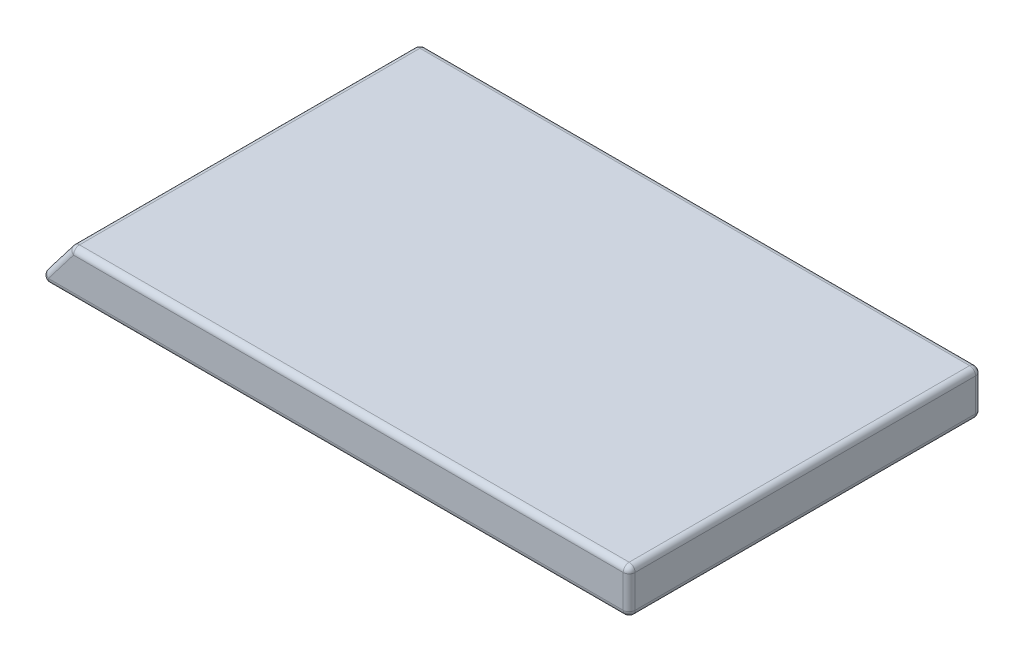
ISO-10303-21;
HEADER;
FILE_DESCRIPTION(('STEP AP214'),'2;1');
FILE_NAME('part.step','',(''),(''),'','','');
FILE_SCHEMA(('AUTOMOTIVE_DESIGN { 1 0 10303 214 1 1 1 1 }'));
ENDSEC;
DATA;
#1=APPLICATION_CONTEXT('core data for automotive mechanical design processes');
#2=APPLICATION_PROTOCOL_DEFINITION('international standard','automotive_design',2000,#1);
#3=PRODUCT_CONTEXT('',#1,'mechanical');
#4=PRODUCT('Part','Part','',(#3));
#5=PRODUCT_RELATED_PRODUCT_CATEGORY('part','',(#4));
#6=PRODUCT_DEFINITION_FORMATION('','',#4);
#7=PRODUCT_DEFINITION_CONTEXT('part definition',#1,'design');
#8=PRODUCT_DEFINITION('design','',#6,#7);
#9=PRODUCT_DEFINITION_SHAPE('','',#8);
#10=(LENGTH_UNIT() NAMED_UNIT(*) SI_UNIT(.MILLI.,.METRE.));
#11=(NAMED_UNIT(*) PLANE_ANGLE_UNIT() SI_UNIT($,.RADIAN.));
#12=(NAMED_UNIT(*) SI_UNIT($,.STERADIAN.) SOLID_ANGLE_UNIT());
#13=UNCERTAINTY_MEASURE_WITH_UNIT(LENGTH_MEASURE(1.E-05),#10,'distance_accuracy_value','');
#14=(GEOMETRIC_REPRESENTATION_CONTEXT(3) GLOBAL_UNCERTAINTY_ASSIGNED_CONTEXT((#13)) GLOBAL_UNIT_ASSIGNED_CONTEXT((#10,
#11,#12)) REPRESENTATION_CONTEXT('',''));
#15=CARTESIAN_POINT('',(0.,0.,0.));
#16=DIRECTION('',(0.,0.,1.));
#17=DIRECTION('',(1.,0.,0.));
#18=AXIS2_PLACEMENT_3D('',#15,#16,#17);
#19=CARTESIAN_POINT('',(0.,75.,296.));
#20=DIRECTION('',(-1.,0.,0.));
#21=DIRECTION('',(0.,0.,1.));
#22=AXIS2_PLACEMENT_3D('',#19,#20,#21);
#23=PLANE('',#22);
#24=DIRECTION('',(0.,1.,0.));
#25=VECTOR('',#24,1.);
#26=CARTESIAN_POINT('',(0.,75.,286.));
#27=LINE('',#26,#25);
#28=CARTESIAN_POINT('',(0.,65.,286.));
#29=VERTEX_POINT('',#28);
#30=CARTESIAN_POINT('',(0.,9.99999999999999,286.));
#31=VERTEX_POINT('',#30);
#32=EDGE_CURVE('E188',#29,#31,#27,.F.);
#33=ORIENTED_EDGE('',*,*,#32,.T.);
#34=DIRECTION('',(0.,0.,-1.));
#35=VECTOR('',#34,1.);
#36=CARTESIAN_POINT('',(0.,9.99999999999999,296.));
#37=LINE('',#36,#35);
#38=CARTESIAN_POINT('',(0.,9.99999999999999,-286.));
#39=VERTEX_POINT('',#38);
#40=EDGE_CURVE('E191',#31,#39,#37,.T.);
#41=ORIENTED_EDGE('',*,*,#40,.T.);
#42=DIRECTION('',(0.,1.,0.));
#43=VECTOR('',#42,1.);
#44=CARTESIAN_POINT('',(0.,75.,-286.));
#45=LINE('',#44,#43);
#46=CARTESIAN_POINT('',(0.,65.,-286.));
#47=VERTEX_POINT('',#46);
#48=EDGE_CURVE('E193',#39,#47,#45,.T.);
#49=ORIENTED_EDGE('',*,*,#48,.T.);
#50=DIRECTION('',(0.,0.,-1.));
#51=VECTOR('',#50,1.);
#52=CARTESIAN_POINT('',(0.,65.,296.));
#53=LINE('',#52,#51);
#54=EDGE_CURVE('E186',#47,#29,#53,.F.);
#55=ORIENTED_EDGE('',*,*,#54,.T.);
#56=EDGE_LOOP('',(#33,#41,#49,#55));
#57=FACE_BOUND('',#56,.T.);
#58=ADVANCED_FACE('F39',(#57),#23,.F.);
#59=CARTESIAN_POINT('',(-938.450475901577,74.9999999999999,296.));
#60=DIRECTION('',(0.,-1.,0.));
#61=DIRECTION('',(1.,0.,0.));
#62=AXIS2_PLACEMENT_3D('',#59,#60,#61);
#63=PLANE('',#62);
#64=DIRECTION('',(-1.,0.,0.));
#65=VECTOR('',#64,1.);
#66=CARTESIAN_POINT('',(-938.450475901577,74.9999999999999,286.));
#67=LINE('',#66,#65);
#68=CARTESIAN_POINT('',(-933.519021641264,74.9999999999999,286.));
#69=VERTEX_POINT('',#68);
#70=CARTESIAN_POINT('',(-10.,75.,286.));
#71=VERTEX_POINT('',#70);
#72=EDGE_CURVE('E48',#69,#71,#67,.F.);
#73=ORIENTED_EDGE('',*,*,#72,.T.);
#74=DIRECTION('',(0.,0.,-1.));
#75=VECTOR('',#74,1.);
#76=CARTESIAN_POINT('',(-10.,75.,296.));
#77=LINE('',#76,#75);
#78=CARTESIAN_POINT('',(-10.,75.,-286.));
#79=VERTEX_POINT('',#78);
#80=EDGE_CURVE('E11',#71,#79,#77,.T.);
#81=ORIENTED_EDGE('',*,*,#80,.T.);
#82=DIRECTION('',(-1.,0.,0.));
#83=VECTOR('',#82,1.);
#84=CARTESIAN_POINT('',(-938.450475901577,74.9999999999999,-286.));
#85=LINE('',#84,#83);
#86=CARTESIAN_POINT('',(-933.519021641264,74.9999999999999,-286.));
#87=VERTEX_POINT('',#86);
#88=EDGE_CURVE('E204',#79,#87,#85,.T.);
#89=ORIENTED_EDGE('',*,*,#88,.T.);
#90=DIRECTION('',(0.,0.,-1.));
#91=VECTOR('',#90,1.);
#92=CARTESIAN_POINT('',(-933.519021641264,74.9999999999999,296.));
#93=LINE('',#92,#91);
#94=EDGE_CURVE('E56',#87,#69,#93,.F.);
#95=ORIENTED_EDGE('',*,*,#94,.T.);
#96=EDGE_LOOP('',(#73,#81,#89,#95));
#97=FACE_BOUND('',#96,.T.);
#98=ADVANCED_FACE('F300',(#97),#63,.F.);
#99=CARTESIAN_POINT('',(-996.,-1.21974821195076E-13,296.));
#100=DIRECTION('',(0.793353340291232,-0.608761429008725,0.));
#101=DIRECTION('',(0.608761429008725,0.793353340291232,0.));
#102=AXIS2_PLACEMENT_3D('',#99,#100,#101);
#103=PLANE('',#102);
#104=DIRECTION('',(0.,0.,-1.));
#105=VECTOR('',#104,1.);
#106=CARTESIAN_POINT('',(-941.452555044177,71.0876142900871,296.));
#107=LINE('',#106,#105);
#108=CARTESIAN_POINT('',(-941.452555044177,71.0876142900871,286.));
#109=VERTEX_POINT('',#108);
#110=CARTESIAN_POINT('',(-941.452555044177,71.0876142900871,-286.));
#111=VERTEX_POINT('',#110);
#112=EDGE_CURVE('E134',#109,#111,#107,.T.);
#113=ORIENTED_EDGE('',*,*,#112,.T.);
#114=DIRECTION('',(-0.608761429008725,-0.793353340291232,0.));
#115=VECTOR('',#114,1.);
#116=CARTESIAN_POINT('',(-996.,-1.18356756033201E-13,-286.));
#117=LINE('',#116,#115);
#118=CARTESIAN_POINT('',(-983.65553938302,16.0876142900872,-286.));
#119=VERTEX_POINT('',#118);
#120=EDGE_CURVE('E170',#111,#119,#117,.T.);
#121=ORIENTED_EDGE('',*,*,#120,.T.);
#122=DIRECTION('',(0.,0.,-1.));
#123=VECTOR('',#122,1.);
#124=CARTESIAN_POINT('',(-983.65553938302,16.0876142900872,296.));
#125=LINE('',#124,#123);
#126=CARTESIAN_POINT('',(-983.65553938302,16.0876142900872,286.));
#127=VERTEX_POINT('',#126);
#128=EDGE_CURVE('E133',#119,#127,#125,.F.);
#129=ORIENTED_EDGE('',*,*,#128,.T.);
#130=DIRECTION('',(-0.608761429008725,-0.793353340291232,0.));
#131=VECTOR('',#130,1.);
#132=CARTESIAN_POINT('',(-996.,-1.21974821195076E-13,286.));
#133=LINE('',#132,#131);
#134=EDGE_CURVE('E127',#127,#109,#133,.F.);
#135=ORIENTED_EDGE('',*,*,#134,.T.);
#136=EDGE_LOOP('',(#113,#121,#129,#135));
#137=FACE_BOUND('',#136,.T.);
#138=ADVANCED_FACE('F126',(#137),#103,.F.);
#139=CARTESIAN_POINT('',(0.,0.,296.));
#140=DIRECTION('',(0.,1.,0.));
#141=DIRECTION('',(-1.,0.,0.));
#142=AXIS2_PLACEMENT_3D('',#139,#140,#141);
#143=PLANE('',#142);
#144=DIRECTION('',(1.,0.,0.));
#145=VECTOR('',#144,1.);
#146=CARTESIAN_POINT('',(0.,0.,286.));
#147=LINE('',#146,#145);
#148=CARTESIAN_POINT('',(-10.,0.,286.));
#149=VERTEX_POINT('',#148);
#150=CARTESIAN_POINT('',(-975.722005980107,-1.19491483148117E-13,286.));
#151=VERTEX_POINT('',#150);
#152=EDGE_CURVE('E176',#149,#151,#147,.F.);
#153=ORIENTED_EDGE('',*,*,#152,.T.);
#154=DIRECTION('',(0.,0.,-1.));
#155=VECTOR('',#154,1.);
#156=CARTESIAN_POINT('',(-975.722005980107,-1.19491483148117E-13,296.));
#157=LINE('',#156,#155);
#158=CARTESIAN_POINT('',(-975.722005980107,-1.19491483148117E-13,-286.));
#159=VERTEX_POINT('',#158);
#160=EDGE_CURVE('E184',#151,#159,#157,.T.);
#161=ORIENTED_EDGE('',*,*,#160,.T.);
#162=DIRECTION('',(1.,0.,0.));
#163=VECTOR('',#162,1.);
#164=CARTESIAN_POINT('',(0.,0.,-286.));
#165=LINE('',#164,#163);
#166=CARTESIAN_POINT('',(-10.,0.,-286.));
#167=VERTEX_POINT('',#166);
#168=EDGE_CURVE('E185',#159,#167,#165,.T.);
#169=ORIENTED_EDGE('',*,*,#168,.T.);
#170=DIRECTION('',(0.,0.,-1.));
#171=VECTOR('',#170,1.);
#172=CARTESIAN_POINT('',(-10.,0.,296.));
#173=LINE('',#172,#171);
#174=EDGE_CURVE('E177',#167,#149,#173,.F.);
#175=ORIENTED_EDGE('',*,*,#174,.T.);
#176=EDGE_LOOP('',(#153,#161,#169,#175));
#177=FACE_BOUND('',#176,.T.);
#178=ADVANCED_FACE('F284',(#177),#143,.F.);
#179=CARTESIAN_POINT('',(0.,0.,296.));
#180=DIRECTION('',(0.,0.,-1.));
#181=DIRECTION('',(-1.,0.,0.));
#182=AXIS2_PLACEMENT_3D('',#179,#180,#181);
#183=PLANE('',#182);
#184=DIRECTION('',(-0.608761429008725,-0.793353340291232,0.));
#185=VECTOR('',#184,1.);
#186=CARTESIAN_POINT('',(-618.958351058138,474.94344720187,296.));
#187=LINE('',#186,#185);
#188=CARTESIAN_POINT('',(-933.519021641264,64.9999999999999,296.));
#189=VERTEX_POINT('',#188);
#190=CARTESIAN_POINT('',(-975.722005980107,9.99999999999989,296.));
#191=VERTEX_POINT('',#190);
#192=EDGE_CURVE('E145',#189,#191,#187,.T.);
#193=ORIENTED_EDGE('',*,*,#192,.T.);
#194=DIRECTION('',(1.,0.,0.));
#195=VECTOR('',#194,1.);
#196=CARTESIAN_POINT('',(0.,10.,296.));
#197=LINE('',#196,#195);
#198=CARTESIAN_POINT('',(-10.,10.,296.));
#199=VERTEX_POINT('',#198);
#200=EDGE_CURVE('E203',#191,#199,#197,.T.);
#201=ORIENTED_EDGE('',*,*,#200,.T.);
#202=DIRECTION('',(0.,1.,0.));
#203=VECTOR('',#202,1.);
#204=CARTESIAN_POINT('',(-10.,0.,296.));
#205=LINE('',#204,#203);
#206=CARTESIAN_POINT('',(-10.,65.,296.));
#207=VERTEX_POINT('',#206);
#208=EDGE_CURVE('E196',#199,#207,#205,.T.);
#209=ORIENTED_EDGE('',*,*,#208,.T.);
#210=DIRECTION('',(-1.,0.,0.));
#211=VECTOR('',#210,1.);
#212=CARTESIAN_POINT('',(0.,65.,296.));
#213=LINE('',#212,#211);
#214=EDGE_CURVE('E198',#207,#189,#213,.T.);
#215=ORIENTED_EDGE('',*,*,#214,.T.);
#216=EDGE_LOOP('',(#193,#201,#209,#215));
#217=FACE_BOUND('',#216,.T.);
#218=ADVANCED_FACE('F268',(#217),#183,.F.);
#219=CARTESIAN_POINT('',(0.,0.,-296.));
#220=DIRECTION('',(0.,0.,-1.));
#221=DIRECTION('',(-1.,0.,0.));
#222=AXIS2_PLACEMENT_3D('',#219,#220,#221);
#223=PLANE('',#222);
#224=DIRECTION('',(1.,0.,0.));
#225=VECTOR('',#224,1.);
#226=CARTESIAN_POINT('',(-996.,9.99999999999988,-296.));
#227=LINE('',#226,#225);
#228=CARTESIAN_POINT('',(-10.,10.,-296.));
#229=VERTEX_POINT('',#228);
#230=CARTESIAN_POINT('',(-975.722005980108,9.99999999999988,-296.));
#231=VERTEX_POINT('',#230);
#232=EDGE_CURVE('E175',#229,#231,#227,.F.);
#233=ORIENTED_EDGE('',*,*,#232,.T.);
#234=DIRECTION('',(-0.608761429008725,-0.793353340291232,0.));
#235=VECTOR('',#234,1.);
#236=CARTESIAN_POINT('',(-930.516942498665,68.9123857099126,-296.));
#237=LINE('',#236,#235);
#238=CARTESIAN_POINT('',(-933.519021641264,64.9999999999999,-296.));
#239=VERTEX_POINT('',#238);
#240=EDGE_CURVE('E172',#231,#239,#237,.F.);
#241=ORIENTED_EDGE('',*,*,#240,.T.);
#242=DIRECTION('',(-1.,0.,0.));
#243=VECTOR('',#242,1.);
#244=CARTESIAN_POINT('',(0.,65.,-296.));
#245=LINE('',#244,#243);
#246=CARTESIAN_POINT('',(-10.,65.,-296.));
#247=VERTEX_POINT('',#246);
#248=EDGE_CURVE('E166',#239,#247,#245,.F.);
#249=ORIENTED_EDGE('',*,*,#248,.T.);
#250=DIRECTION('',(0.,1.,0.));
#251=VECTOR('',#250,1.);
#252=CARTESIAN_POINT('',(-10.,0.,-296.));
#253=LINE('',#252,#251);
#254=EDGE_CURVE('E174',#247,#229,#253,.F.);
#255=ORIENTED_EDGE('',*,*,#254,.T.);
#256=EDGE_LOOP('',(#233,#241,#249,#255));
#257=FACE_BOUND('',#256,.T.);
#258=ADVANCED_FACE('F483',(#257),#223,.T.);
#259=CARTESIAN_POINT('',(-10.,0.,286.));
#260=DIRECTION('',(0.,1.,0.));
#261=DIRECTION('',(0.,0.,1.));
#262=AXIS2_PLACEMENT_3D('',#259,#260,#261);
#263=CYLINDRICAL_SURFACE('',#262,10.);
#264=CARTESIAN_POINT('',(-10.,65.,286.));
#265=DIRECTION('',(0.,1.,0.));
#266=DIRECTION('',(0.,0.,1.));
#267=AXIS2_PLACEMENT_3D('',#264,#265,#266);
#268=CIRCLE('',#267,10.);
#269=EDGE_CURVE('E43',#207,#29,#268,.T.);
#270=ORIENTED_EDGE('',*,*,#269,.F.);
#271=ORIENTED_EDGE('',*,*,#208,.F.);
#272=CARTESIAN_POINT('',(-10.,9.99999999999999,286.));
#273=DIRECTION('',(0.,-1.,0.));
#274=DIRECTION('',(0.,0.,-1.));
#275=AXIS2_PLACEMENT_3D('',#272,#273,#274);
#276=CIRCLE('',#275,10.);
#277=EDGE_CURVE('E163',#31,#199,#276,.T.);
#278=ORIENTED_EDGE('',*,*,#277,.F.);
#279=ORIENTED_EDGE('',*,*,#32,.F.);
#280=EDGE_LOOP('',(#270,#271,#278,#279));
#281=FACE_BOUND('',#280,.T.);
#282=ADVANCED_FACE('F41',(#281),#263,.T.);
#283=CARTESIAN_POINT('',(-10.,65.,286.));
#284=DIRECTION('',(1.,0.,0.));
#285=DIRECTION('',(0.,0.,-1.));
#286=AXIS2_PLACEMENT_3D('',#283,#284,#285);
#287=SPHERICAL_SURFACE('',#286,10.);
#288=CARTESIAN_POINT('',(-10.,65.,286.));
#289=DIRECTION('',(1.,0.,0.));
#290=DIRECTION('',(0.,0.,-1.));
#291=AXIS2_PLACEMENT_3D('',#288,#289,#290);
#292=CIRCLE('',#291,10.);
#293=EDGE_CURVE('E249',#207,#71,#292,.F.);
#294=ORIENTED_EDGE('',*,*,#293,.F.);
#295=ORIENTED_EDGE('',*,*,#269,.T.);
#296=CARTESIAN_POINT('',(-10.,65.,286.));
#297=DIRECTION('',(0.,0.,1.));
#298=DIRECTION('',(1.,0.,0.));
#299=AXIS2_PLACEMENT_3D('',#296,#297,#298);
#300=CIRCLE('',#299,10.);
#301=EDGE_CURVE('E253',#71,#29,#300,.F.);
#302=ORIENTED_EDGE('',*,*,#301,.F.);
#303=EDGE_LOOP('',(#294,#295,#302));
#304=FACE_BOUND('',#303,.T.);
#305=ADVANCED_FACE('F292',(#304),#287,.T.);
#306=CARTESIAN_POINT('',(-10.,10.,286.));
#307=DIRECTION('',(0.,0.,1.));
#308=DIRECTION('',(1.,0.,0.));
#309=AXIS2_PLACEMENT_3D('',#306,#307,#308);
#310=SPHERICAL_SURFACE('',#309,10.);
#311=CARTESIAN_POINT('',(-10.,10.,286.));
#312=DIRECTION('',(0.,0.,1.));
#313=DIRECTION('',(1.,0.,0.));
#314=AXIS2_PLACEMENT_3D('',#311,#312,#313);
#315=CIRCLE('',#314,10.);
#316=EDGE_CURVE('E243',#31,#149,#315,.F.);
#317=ORIENTED_EDGE('',*,*,#316,.F.);
#318=ORIENTED_EDGE('',*,*,#277,.T.);
#319=CARTESIAN_POINT('',(-10.,10.,286.));
#320=DIRECTION('',(1.,0.,0.));
#321=DIRECTION('',(0.,1.,0.));
#322=AXIS2_PLACEMENT_3D('',#319,#320,#321);
#323=CIRCLE('',#322,10.);
#324=EDGE_CURVE('E250',#149,#199,#323,.F.);
#325=ORIENTED_EDGE('',*,*,#324,.F.);
#326=EDGE_LOOP('',(#317,#318,#325));
#327=FACE_BOUND('',#326,.T.);
#328=ADVANCED_FACE('F259',(#327),#310,.T.);
#329=CARTESIAN_POINT('',(-10.,65.,296.));
#330=DIRECTION('',(0.,0.,-1.));
#331=DIRECTION('',(-1.,0.,0.));
#332=AXIS2_PLACEMENT_3D('',#329,#330,#331);
#333=CYLINDRICAL_SURFACE('',#332,10.);
#334=ORIENTED_EDGE('',*,*,#301,.T.);
#335=ORIENTED_EDGE('',*,*,#54,.F.);
#336=CARTESIAN_POINT('',(-10.,65.,-286.));
#337=DIRECTION('',(0.,0.,-1.));
#338=DIRECTION('',(-1.,0.,0.));
#339=AXIS2_PLACEMENT_3D('',#336,#337,#338);
#340=CIRCLE('',#339,10.);
#341=EDGE_CURVE('E236',#79,#47,#340,.T.);
#342=ORIENTED_EDGE('',*,*,#341,.F.);
#343=ORIENTED_EDGE('',*,*,#80,.F.);
#344=EDGE_LOOP('',(#334,#335,#342,#343));
#345=FACE_BOUND('',#344,.T.);
#346=ADVANCED_FACE('F293',(#345),#333,.T.);
#347=CARTESIAN_POINT('',(0.,65.,286.));
#348=DIRECTION('',(-1.,0.,0.));
#349=DIRECTION('',(0.,-1.,0.));
#350=AXIS2_PLACEMENT_3D('',#347,#348,#349);
#351=CYLINDRICAL_SURFACE('',#350,10.);
#352=ORIENTED_EDGE('',*,*,#293,.T.);
#353=ORIENTED_EDGE('',*,*,#72,.F.);
#354=CARTESIAN_POINT('',(-933.519021641264,64.9999999999999,286.));
#355=DIRECTION('',(-1.,0.,0.));
#356=DIRECTION('',(0.,-1.,0.));
#357=AXIS2_PLACEMENT_3D('',#354,#355,#356);
#358=CIRCLE('',#357,10.);
#359=EDGE_CURVE('E146',#189,#69,#358,.T.);
#360=ORIENTED_EDGE('',*,*,#359,.F.);
#361=ORIENTED_EDGE('',*,*,#214,.F.);
#362=EDGE_LOOP('',(#352,#353,#360,#361));
#363=FACE_BOUND('',#362,.T.);
#364=ADVANCED_FACE('F446',(#363),#351,.T.);
#365=CARTESIAN_POINT('',(-618.958351058138,474.94344720187,286.));
#366=DIRECTION('',(-0.608761429008725,-0.793353340291232,0.));
#367=DIRECTION('',(0.793353340291232,-0.608761429008725,0.));
#368=AXIS2_PLACEMENT_3D('',#365,#366,#367);
#369=CYLINDRICAL_SURFACE('',#368,10.);
#370=CARTESIAN_POINT('',(-975.722005980107,9.99999999999989,286.));
#371=DIRECTION('',(-0.608761429008727,-0.79335334029123,0.));
#372=DIRECTION('',(0.79335334029123,-0.608761429008727,0.));
#373=AXIS2_PLACEMENT_3D('',#370,#371,#372);
#374=CIRCLE('',#373,10.);
#375=EDGE_CURVE('E149',#191,#127,#374,.T.);
#376=ORIENTED_EDGE('',*,*,#375,.F.);
#377=ORIENTED_EDGE('',*,*,#192,.F.);
#378=CARTESIAN_POINT('',(-933.519021641264,64.9999999999999,286.));
#379=DIRECTION('',(0.608761429008723,0.793353340291233,0.));
#380=DIRECTION('',(-0.793353340291233,0.608761429008723,0.));
#381=AXIS2_PLACEMENT_3D('',#378,#379,#380);
#382=CIRCLE('',#381,10.);
#383=EDGE_CURVE('E143',#109,#189,#382,.T.);
#384=ORIENTED_EDGE('',*,*,#383,.F.);
#385=ORIENTED_EDGE('',*,*,#134,.F.);
#386=EDGE_LOOP('',(#376,#377,#384,#385));
#387=FACE_BOUND('',#386,.T.);
#388=ADVANCED_FACE('F141',(#387),#369,.T.);
#389=CARTESIAN_POINT('',(0.,10.,286.));
#390=DIRECTION('',(1.,0.,0.));
#391=DIRECTION('',(0.,1.,0.));
#392=AXIS2_PLACEMENT_3D('',#389,#390,#391);
#393=CYLINDRICAL_SURFACE('',#392,10.);
#394=ORIENTED_EDGE('',*,*,#324,.T.);
#395=ORIENTED_EDGE('',*,*,#200,.F.);
#396=CARTESIAN_POINT('',(-975.722005980107,9.99999999999988,286.));
#397=DIRECTION('',(-1.,0.,0.));
#398=DIRECTION('',(0.,0.,1.));
#399=AXIS2_PLACEMENT_3D('',#396,#397,#398);
#400=CIRCLE('',#399,10.);
#401=EDGE_CURVE('E231',#151,#191,#400,.T.);
#402=ORIENTED_EDGE('',*,*,#401,.F.);
#403=ORIENTED_EDGE('',*,*,#152,.F.);
#404=EDGE_LOOP('',(#394,#395,#402,#403));
#405=FACE_BOUND('',#404,.T.);
#406=ADVANCED_FACE('F271',(#405),#393,.T.);
#407=CARTESIAN_POINT('',(-10.,9.99999999999999,296.));
#408=DIRECTION('',(0.,0.,-1.));
#409=DIRECTION('',(-1.,0.,0.));
#410=AXIS2_PLACEMENT_3D('',#407,#408,#409);
#411=CYLINDRICAL_SURFACE('',#410,10.);
#412=ORIENTED_EDGE('',*,*,#316,.T.);
#413=ORIENTED_EDGE('',*,*,#174,.F.);
#414=CARTESIAN_POINT('',(-10.,9.99999999999999,-286.));
#415=DIRECTION('',(0.,0.,-1.));
#416=DIRECTION('',(-1.,0.,0.));
#417=AXIS2_PLACEMENT_3D('',#414,#415,#416);
#418=CIRCLE('',#417,10.);
#419=EDGE_CURVE('E227',#39,#167,#418,.T.);
#420=ORIENTED_EDGE('',*,*,#419,.F.);
#421=ORIENTED_EDGE('',*,*,#40,.F.);
#422=EDGE_LOOP('',(#412,#413,#420,#421));
#423=FACE_BOUND('',#422,.T.);
#424=ADVANCED_FACE('F282',(#423),#411,.T.);
#425=CARTESIAN_POINT('',(-10.,75.,-286.));
#426=DIRECTION('',(0.,-1.,0.));
#427=DIRECTION('',(0.,0.,-1.));
#428=AXIS2_PLACEMENT_3D('',#425,#426,#427);
#429=CYLINDRICAL_SURFACE('',#428,10.);
#430=CARTESIAN_POINT('',(-10.,65.,-286.));
#431=DIRECTION('',(0.,1.,0.));
#432=DIRECTION('',(0.,0.,1.));
#433=AXIS2_PLACEMENT_3D('',#430,#431,#432);
#434=CIRCLE('',#433,10.);
#435=EDGE_CURVE('E244',#47,#247,#434,.T.);
#436=ORIENTED_EDGE('',*,*,#435,.F.);
#437=ORIENTED_EDGE('',*,*,#48,.F.);
#438=CARTESIAN_POINT('',(-10.,10.,-286.));
#439=DIRECTION('',(0.,-1.,0.));
#440=DIRECTION('',(1.,0.,0.));
#441=AXIS2_PLACEMENT_3D('',#438,#439,#440);
#442=CIRCLE('',#441,10.);
#443=EDGE_CURVE('E230',#229,#39,#442,.T.);
#444=ORIENTED_EDGE('',*,*,#443,.F.);
#445=ORIENTED_EDGE('',*,*,#254,.F.);
#446=EDGE_LOOP('',(#436,#437,#444,#445));
#447=FACE_BOUND('',#446,.T.);
#448=ADVANCED_FACE('F323',(#447),#429,.T.);
#449=CARTESIAN_POINT('',(-10.,65.,-286.));
#450=DIRECTION('',(1.,0.,0.));
#451=DIRECTION('',(0.,0.,-1.));
#452=AXIS2_PLACEMENT_3D('',#449,#450,#451);
#453=SPHERICAL_SURFACE('',#452,10.);
#454=ORIENTED_EDGE('',*,*,#341,.T.);
#455=ORIENTED_EDGE('',*,*,#435,.T.);
#456=CARTESIAN_POINT('',(-10.,65.,-286.));
#457=DIRECTION('',(1.,0.,0.));
#458=DIRECTION('',(0.,1.,0.));
#459=AXIS2_PLACEMENT_3D('',#456,#457,#458);
#460=CIRCLE('',#459,10.);
#461=EDGE_CURVE('E154',#79,#247,#460,.F.);
#462=ORIENTED_EDGE('',*,*,#461,.F.);
#463=EDGE_LOOP('',(#454,#455,#462));
#464=FACE_BOUND('',#463,.T.);
#465=ADVANCED_FACE('F324',(#464),#453,.T.);
#466=CARTESIAN_POINT('',(-933.519021641264,64.9999999999999,286.));
#467=DIRECTION('',(0.,0.,1.));
#468=DIRECTION('',(1.,0.,0.));
#469=AXIS2_PLACEMENT_3D('',#466,#467,#468);
#470=SPHERICAL_SURFACE('',#469,10.);
#471=ORIENTED_EDGE('',*,*,#383,.T.);
#472=ORIENTED_EDGE('',*,*,#359,.T.);
#473=CARTESIAN_POINT('',(-933.519021641264,64.9999999999999,286.));
#474=DIRECTION('',(0.,0.,1.));
#475=DIRECTION('',(1.,0.,0.));
#476=AXIS2_PLACEMENT_3D('',#473,#474,#475);
#477=CIRCLE('',#476,10.);
#478=EDGE_CURVE('E155',#109,#69,#477,.F.);
#479=ORIENTED_EDGE('',*,*,#478,.F.);
#480=EDGE_LOOP('',(#471,#472,#479));
#481=FACE_BOUND('',#480,.T.);
#482=ADVANCED_FACE('F153',(#481),#470,.T.);
#483=CARTESIAN_POINT('',(-975.722005980108,9.99999999999988,286.));
#484=DIRECTION('',(0.,0.,1.));
#485=DIRECTION('',(1.,0.,0.));
#486=AXIS2_PLACEMENT_3D('',#483,#484,#485);
#487=SPHERICAL_SURFACE('',#486,10.);
#488=ORIENTED_EDGE('',*,*,#401,.T.);
#489=ORIENTED_EDGE('',*,*,#375,.T.);
#490=CARTESIAN_POINT('',(-975.722005980107,9.99999999999995,286.));
#491=DIRECTION('',(0.,0.,1.));
#492=DIRECTION('',(1.,0.,0.));
#493=AXIS2_PLACEMENT_3D('',#490,#491,#492);
#494=CIRCLE('',#493,10.);
#495=EDGE_CURVE('E156',#151,#127,#494,.F.);
#496=ORIENTED_EDGE('',*,*,#495,.F.);
#497=EDGE_LOOP('',(#488,#489,#496));
#498=FACE_BOUND('',#497,.T.);
#499=ADVANCED_FACE('F273',(#498),#487,.T.);
#500=CARTESIAN_POINT('',(-10.,10.,-286.));
#501=DIRECTION('',(1.,0.,0.));
#502=DIRECTION('',(0.,1.,0.));
#503=AXIS2_PLACEMENT_3D('',#500,#501,#502);
#504=SPHERICAL_SURFACE('',#503,10.);
#505=ORIENTED_EDGE('',*,*,#443,.T.);
#506=ORIENTED_EDGE('',*,*,#419,.T.);
#507=CARTESIAN_POINT('',(-10.,10.,-286.));
#508=DIRECTION('',(1.,0.,0.));
#509=DIRECTION('',(0.,1.,0.));
#510=AXIS2_PLACEMENT_3D('',#507,#508,#509);
#511=CIRCLE('',#510,10.);
#512=EDGE_CURVE('E222',#229,#167,#511,.F.);
#513=ORIENTED_EDGE('',*,*,#512,.F.);
#514=EDGE_LOOP('',(#505,#506,#513));
#515=FACE_BOUND('',#514,.T.);
#516=ADVANCED_FACE('F317',(#515),#504,.T.);
#517=CARTESIAN_POINT('',(-938.450475901577,64.9999999999999,-286.));
#518=DIRECTION('',(1.,0.,0.));
#519=DIRECTION('',(0.,1.,0.));
#520=AXIS2_PLACEMENT_3D('',#517,#518,#519);
#521=CYLINDRICAL_SURFACE('',#520,10.);
#522=ORIENTED_EDGE('',*,*,#461,.T.);
#523=ORIENTED_EDGE('',*,*,#248,.F.);
#524=CARTESIAN_POINT('',(-933.519021641264,64.9999999999999,-286.));
#525=DIRECTION('',(-1.,0.,0.));
#526=DIRECTION('',(0.,0.,1.));
#527=AXIS2_PLACEMENT_3D('',#524,#525,#526);
#528=CIRCLE('',#527,10.);
#529=EDGE_CURVE('E217',#87,#239,#528,.T.);
#530=ORIENTED_EDGE('',*,*,#529,.F.);
#531=ORIENTED_EDGE('',*,*,#88,.F.);
#532=EDGE_LOOP('',(#522,#523,#530,#531));
#533=FACE_BOUND('',#532,.T.);
#534=ADVANCED_FACE('F301',(#533),#521,.T.);
#535=CARTESIAN_POINT('',(-933.519021641264,64.9999999999999,296.));
#536=DIRECTION('',(0.,0.,-1.));
#537=DIRECTION('',(-1.,0.,0.));
#538=AXIS2_PLACEMENT_3D('',#535,#536,#537);
#539=CYLINDRICAL_SURFACE('',#538,10.);
#540=ORIENTED_EDGE('',*,*,#478,.T.);
#541=ORIENTED_EDGE('',*,*,#94,.F.);
#542=CARTESIAN_POINT('',(-933.519021641264,64.9999999999999,-286.));
#543=DIRECTION('',(0.,0.,-1.));
#544=DIRECTION('',(-1.,0.,0.));
#545=AXIS2_PLACEMENT_3D('',#542,#543,#544);
#546=CIRCLE('',#545,10.);
#547=EDGE_CURVE('E159',#111,#87,#546,.T.);
#548=ORIENTED_EDGE('',*,*,#547,.F.);
#549=ORIENTED_EDGE('',*,*,#112,.F.);
#550=EDGE_LOOP('',(#540,#541,#548,#549));
#551=FACE_BOUND('',#550,.T.);
#552=ADVANCED_FACE('F158',(#551),#539,.T.);
#553=CARTESIAN_POINT('',(-975.722005980107,9.99999999999988,296.));
#554=DIRECTION('',(0.,0.,-1.));
#555=DIRECTION('',(-1.,0.,0.));
#556=AXIS2_PLACEMENT_3D('',#553,#554,#555);
#557=CYLINDRICAL_SURFACE('',#556,10.);
#558=ORIENTED_EDGE('',*,*,#495,.T.);
#559=ORIENTED_EDGE('',*,*,#128,.F.);
#560=CARTESIAN_POINT('',(-975.722005980107,9.99999999999988,-286.));
#561=DIRECTION('',(0.,0.,-1.));
#562=DIRECTION('',(-1.,0.,0.));
#563=AXIS2_PLACEMENT_3D('',#560,#561,#562);
#564=CIRCLE('',#563,10.);
#565=EDGE_CURVE('E212',#159,#119,#564,.T.);
#566=ORIENTED_EDGE('',*,*,#565,.F.);
#567=ORIENTED_EDGE('',*,*,#160,.F.);
#568=EDGE_LOOP('',(#558,#559,#566,#567));
#569=FACE_BOUND('',#568,.T.);
#570=ADVANCED_FACE('F279',(#569),#557,.T.);
#571=CARTESIAN_POINT('',(0.,10.,-286.));
#572=DIRECTION('',(-1.,0.,0.));
#573=DIRECTION('',(0.,-1.,0.));
#574=AXIS2_PLACEMENT_3D('',#571,#572,#573);
#575=CYLINDRICAL_SURFACE('',#574,10.);
#576=ORIENTED_EDGE('',*,*,#512,.T.);
#577=ORIENTED_EDGE('',*,*,#168,.F.);
#578=CARTESIAN_POINT('',(-975.722005980108,9.99999999999988,-286.));
#579=DIRECTION('',(-1.,0.,0.));
#580=DIRECTION('',(0.,-1.,0.));
#581=AXIS2_PLACEMENT_3D('',#578,#579,#580);
#582=CIRCLE('',#581,10.);
#583=EDGE_CURVE('E215',#231,#159,#582,.T.);
#584=ORIENTED_EDGE('',*,*,#583,.F.);
#585=ORIENTED_EDGE('',*,*,#232,.F.);
#586=EDGE_LOOP('',(#576,#577,#584,#585));
#587=FACE_BOUND('',#586,.T.);
#588=ADVANCED_FACE('F316',(#587),#575,.T.);
#589=CARTESIAN_POINT('',(-933.519021641264,64.9999999999999,-286.));
#590=DIRECTION('',(0.,0.,-1.));
#591=DIRECTION('',(-1.,0.,0.));
#592=AXIS2_PLACEMENT_3D('',#589,#590,#591);
#593=SPHERICAL_SURFACE('',#592,10.);
#594=ORIENTED_EDGE('',*,*,#547,.T.);
#595=ORIENTED_EDGE('',*,*,#529,.T.);
#596=CARTESIAN_POINT('',(-933.519021641264,64.9999999999999,-286.));
#597=DIRECTION('',(0.608761429008722,0.793353340291234,0.));
#598=DIRECTION('',(-0.793353340291234,0.608761429008722,0.));
#599=AXIS2_PLACEMENT_3D('',#596,#597,#598);
#600=CIRCLE('',#599,10.);
#601=EDGE_CURVE('E209',#111,#239,#600,.F.);
#602=ORIENTED_EDGE('',*,*,#601,.F.);
#603=EDGE_LOOP('',(#594,#595,#602));
#604=FACE_BOUND('',#603,.T.);
#605=ADVANCED_FACE('F302',(#604),#593,.T.);
#606=CARTESIAN_POINT('',(-975.722005980108,9.99999999999988,-286.));
#607=DIRECTION('',(0.,0.,-1.));
#608=DIRECTION('',(0.,1.,0.));
#609=AXIS2_PLACEMENT_3D('',#606,#607,#608);
#610=SPHERICAL_SURFACE('',#609,10.);
#611=ORIENTED_EDGE('',*,*,#583,.T.);
#612=ORIENTED_EDGE('',*,*,#565,.T.);
#613=CARTESIAN_POINT('',(-975.722005980107,9.99999999999996,-286.));
#614=DIRECTION('',(-0.608761429008723,-0.793353340291234,0.));
#615=DIRECTION('',(0.793353340291234,-0.608761429008723,0.));
#616=AXIS2_PLACEMENT_3D('',#613,#614,#615);
#617=CIRCLE('',#616,10.);
#618=EDGE_CURVE('E208',#231,#119,#617,.F.);
#619=ORIENTED_EDGE('',*,*,#618,.F.);
#620=EDGE_LOOP('',(#611,#612,#619));
#621=FACE_BOUND('',#620,.T.);
#622=ADVANCED_FACE('F315',(#621),#610,.T.);
#623=CARTESIAN_POINT('',(-988.066466597088,-6.08761429008737,-286.));
#624=DIRECTION('',(0.608761429008725,0.793353340291232,0.));
#625=DIRECTION('',(-0.793353340291232,0.608761429008725,0.));
#626=AXIS2_PLACEMENT_3D('',#623,#624,#625);
#627=CYLINDRICAL_SURFACE('',#626,10.);
#628=ORIENTED_EDGE('',*,*,#601,.T.);
#629=ORIENTED_EDGE('',*,*,#240,.F.);
#630=ORIENTED_EDGE('',*,*,#618,.T.);
#631=ORIENTED_EDGE('',*,*,#120,.F.);
#632=EDGE_LOOP('',(#628,#629,#630,#631));
#633=FACE_BOUND('',#632,.T.);
#634=ADVANCED_FACE('F310',(#633),#627,.T.);
#635=CLOSED_SHELL('',(#58,#98,#138,#178,#218,#258,#282,#305,#328,#346,#364,#388,#406,#424,#448,
#465,#482,#499,#516,#534,#552,#570,#588,#605,#622,#634));
#636=MANIFOLD_SOLID_BREP('B2',#635);
#637=ADVANCED_BREP_SHAPE_REPRESENTATION('',(#18,#636),#14);
#638=SHAPE_DEFINITION_REPRESENTATION(#9,#637);
ENDSEC;
END-ISO-10303-21;
